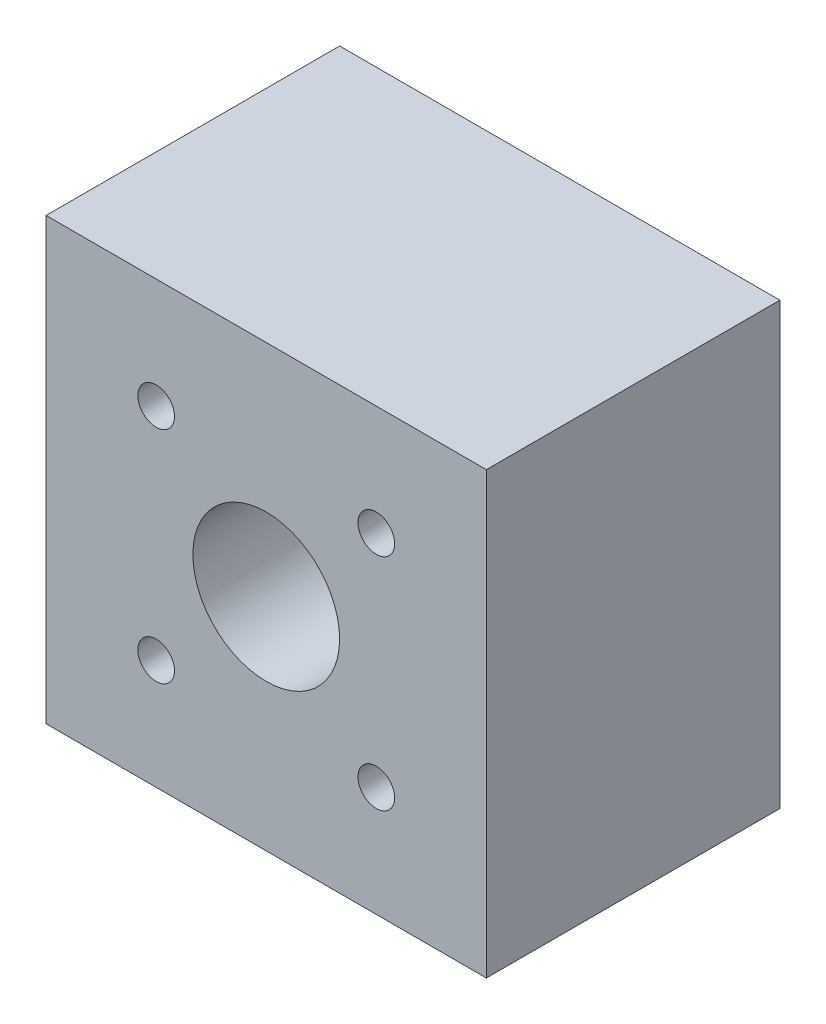
ISO-10303-21;
HEADER;
FILE_DESCRIPTION(('STEP AP214'),'2;1');
FILE_NAME('part.step','',(''),(''),'','','');
FILE_SCHEMA(('AUTOMOTIVE_DESIGN { 1 0 10303 214 1 1 1 1 }'));
ENDSEC;
DATA;
#1=APPLICATION_CONTEXT('core data for automotive mechanical design processes');
#2=APPLICATION_PROTOCOL_DEFINITION('international standard','automotive_design',2000,#1);
#3=PRODUCT_CONTEXT('',#1,'mechanical');
#4=PRODUCT('Part','Part','',(#3));
#5=PRODUCT_RELATED_PRODUCT_CATEGORY('part','',(#4));
#6=PRODUCT_DEFINITION_FORMATION('','',#4);
#7=PRODUCT_DEFINITION_CONTEXT('part definition',#1,'design');
#8=PRODUCT_DEFINITION('design','',#6,#7);
#9=PRODUCT_DEFINITION_SHAPE('','',#8);
#10=(LENGTH_UNIT() NAMED_UNIT(*) SI_UNIT(.MILLI.,.METRE.));
#11=(NAMED_UNIT(*) PLANE_ANGLE_UNIT() SI_UNIT($,.RADIAN.));
#12=(NAMED_UNIT(*) SI_UNIT($,.STERADIAN.) SOLID_ANGLE_UNIT());
#13=UNCERTAINTY_MEASURE_WITH_UNIT(LENGTH_MEASURE(1.E-05),#10,'distance_accuracy_value','');
#14=(GEOMETRIC_REPRESENTATION_CONTEXT(3) GLOBAL_UNCERTAINTY_ASSIGNED_CONTEXT((#13)) GLOBAL_UNIT_ASSIGNED_CONTEXT((#10,
#11,#12)) REPRESENTATION_CONTEXT('',''));
#15=CARTESIAN_POINT('',(0.,0.,0.));
#16=DIRECTION('',(0.,0.,1.));
#17=DIRECTION('',(1.,0.,0.));
#18=AXIS2_PLACEMENT_3D('',#15,#16,#17);
#19=CARTESIAN_POINT('',(15.,15.,0.));
#20=DIRECTION('',(0.,0.,-1.));
#21=DIRECTION('',(1.,0.,0.));
#22=AXIS2_PLACEMENT_3D('',#19,#20,#21);
#23=CYLINDRICAL_SURFACE('',#22,2.5);
#24=CARTESIAN_POINT('',(15.,15.,0.));
#25=DIRECTION('',(0.,0.,1.));
#26=DIRECTION('',(1.,0.,0.));
#27=AXIS2_PLACEMENT_3D('',#24,#25,#26);
#28=CIRCLE('',#27,2.5);
#29=CARTESIAN_POINT('',(17.5,15.,0.));
#30=VERTEX_POINT('',#29);
#31=EDGE_CURVE('E109',#30,#30,#28,.T.);
#32=ORIENTED_EDGE('',*,*,#31,.F.);
#33=DIRECTION('',(0.,0.,1.));
#34=VECTOR('',#33,1.);
#35=CARTESIAN_POINT('',(17.5,15.,0.));
#36=LINE('',#35,#34);
#37=CARTESIAN_POINT('',(17.5,15.,40.));
#38=VERTEX_POINT('',#37);
#39=EDGE_CURVE('E10',#30,#38,#36,.T.);
#40=ORIENTED_EDGE('',*,*,#39,.T.);
#41=CARTESIAN_POINT('',(15.,15.,40.));
#42=DIRECTION('',(0.,0.,-1.));
#43=DIRECTION('',(1.,0.,0.));
#44=AXIS2_PLACEMENT_3D('',#41,#42,#43);
#45=CIRCLE('',#44,2.5);
#46=EDGE_CURVE('E110',#38,#38,#45,.T.);
#47=ORIENTED_EDGE('',*,*,#46,.F.);
#48=ORIENTED_EDGE('',*,*,#39,.F.);
#49=EDGE_LOOP('',(#32,#40,#47,#48));
#50=FACE_BOUND('',#49,.T.);
#51=ADVANCED_FACE('F16',(#50),#23,.F.);
#52=CARTESIAN_POINT('',(0.,0.,0.));
#53=DIRECTION('',(0.,0.,-1.));
#54=DIRECTION('',(1.,0.,0.));
#55=AXIS2_PLACEMENT_3D('',#52,#53,#54);
#56=CYLINDRICAL_SURFACE('',#55,10.);
#57=DIRECTION('',(0.,0.,1.));
#58=VECTOR('',#57,1.);
#59=CARTESIAN_POINT('',(10.,0.,0.));
#60=LINE('',#59,#58);
#61=CARTESIAN_POINT('',(10.,0.,0.));
#62=VERTEX_POINT('',#61);
#63=CARTESIAN_POINT('',(10.,0.,40.));
#64=VERTEX_POINT('',#63);
#65=EDGE_CURVE('E25',#62,#64,#60,.T.);
#66=ORIENTED_EDGE('',*,*,#65,.F.);
#67=CARTESIAN_POINT('',(0.,0.,0.));
#68=DIRECTION('',(0.,0.,1.));
#69=DIRECTION('',(1.,0.,0.));
#70=AXIS2_PLACEMENT_3D('',#67,#68,#69);
#71=CIRCLE('',#70,10.);
#72=EDGE_CURVE('E116',#62,#62,#71,.T.);
#73=ORIENTED_EDGE('',*,*,#72,.F.);
#74=ORIENTED_EDGE('',*,*,#65,.T.);
#75=CARTESIAN_POINT('',(0.,0.,40.));
#76=DIRECTION('',(0.,0.,-1.));
#77=DIRECTION('',(1.,0.,0.));
#78=AXIS2_PLACEMENT_3D('',#75,#76,#77);
#79=CIRCLE('',#78,10.);
#80=EDGE_CURVE('E141',#64,#64,#79,.T.);
#81=ORIENTED_EDGE('',*,*,#80,.F.);
#82=EDGE_LOOP('',(#66,#73,#74,#81));
#83=FACE_BOUND('',#82,.T.);
#84=ADVANCED_FACE('F253',(#83),#56,.F.);
#85=CARTESIAN_POINT('',(-15.,15.,0.));
#86=DIRECTION('',(0.,0.,-1.));
#87=DIRECTION('',(1.,0.,0.));
#88=AXIS2_PLACEMENT_3D('',#85,#86,#87);
#89=CYLINDRICAL_SURFACE('',#88,2.5);
#90=CARTESIAN_POINT('',(-15.,15.,0.));
#91=DIRECTION('',(0.,0.,1.));
#92=DIRECTION('',(1.,0.,0.));
#93=AXIS2_PLACEMENT_3D('',#90,#91,#92);
#94=CIRCLE('',#93,2.5);
#95=CARTESIAN_POINT('',(-12.5,15.,0.));
#96=VERTEX_POINT('',#95);
#97=EDGE_CURVE('E125',#96,#96,#94,.T.);
#98=ORIENTED_EDGE('',*,*,#97,.F.);
#99=DIRECTION('',(0.,0.,1.));
#100=VECTOR('',#99,1.);
#101=CARTESIAN_POINT('',(-12.5,15.,0.));
#102=LINE('',#101,#100);
#103=CARTESIAN_POINT('',(-12.5,15.,40.));
#104=VERTEX_POINT('',#103);
#105=EDGE_CURVE('E151',#96,#104,#102,.T.);
#106=ORIENTED_EDGE('',*,*,#105,.T.);
#107=CARTESIAN_POINT('',(-15.,15.,40.));
#108=DIRECTION('',(0.,0.,-1.));
#109=DIRECTION('',(1.,0.,0.));
#110=AXIS2_PLACEMENT_3D('',#107,#108,#109);
#111=CIRCLE('',#110,2.5);
#112=EDGE_CURVE('E137',#104,#104,#111,.T.);
#113=ORIENTED_EDGE('',*,*,#112,.F.);
#114=ORIENTED_EDGE('',*,*,#105,.F.);
#115=EDGE_LOOP('',(#98,#106,#113,#114));
#116=FACE_BOUND('',#115,.T.);
#117=ADVANCED_FACE('F258',(#116),#89,.F.);
#118=CARTESIAN_POINT('',(15.,-15.,0.));
#119=DIRECTION('',(0.,0.,-1.));
#120=DIRECTION('',(1.,0.,0.));
#121=AXIS2_PLACEMENT_3D('',#118,#119,#120);
#122=CYLINDRICAL_SURFACE('',#121,2.5);
#123=CARTESIAN_POINT('',(15.,-15.,0.));
#124=DIRECTION('',(0.,0.,1.));
#125=DIRECTION('',(1.,0.,0.));
#126=AXIS2_PLACEMENT_3D('',#123,#124,#125);
#127=CIRCLE('',#126,2.5);
#128=CARTESIAN_POINT('',(17.5,-15.,0.));
#129=VERTEX_POINT('',#128);
#130=EDGE_CURVE('E164',#129,#129,#127,.T.);
#131=ORIENTED_EDGE('',*,*,#130,.F.);
#132=DIRECTION('',(0.,0.,1.));
#133=VECTOR('',#132,1.);
#134=CARTESIAN_POINT('',(17.5,-15.,0.));
#135=LINE('',#134,#133);
#136=CARTESIAN_POINT('',(17.5,-15.,40.));
#137=VERTEX_POINT('',#136);
#138=EDGE_CURVE('E149',#129,#137,#135,.T.);
#139=ORIENTED_EDGE('',*,*,#138,.T.);
#140=CARTESIAN_POINT('',(15.,-15.,40.));
#141=DIRECTION('',(0.,0.,-1.));
#142=DIRECTION('',(1.,0.,0.));
#143=AXIS2_PLACEMENT_3D('',#140,#141,#142);
#144=CIRCLE('',#143,2.5);
#145=EDGE_CURVE('E133',#137,#137,#144,.T.);
#146=ORIENTED_EDGE('',*,*,#145,.F.);
#147=ORIENTED_EDGE('',*,*,#138,.F.);
#148=EDGE_LOOP('',(#131,#139,#146,#147));
#149=FACE_BOUND('',#148,.T.);
#150=ADVANCED_FACE('F18',(#149),#122,.F.);
#151=CARTESIAN_POINT('',(-15.,-15.,0.));
#152=DIRECTION('',(0.,0.,-1.));
#153=DIRECTION('',(1.,0.,0.));
#154=AXIS2_PLACEMENT_3D('',#151,#152,#153);
#155=CYLINDRICAL_SURFACE('',#154,2.5);
#156=CARTESIAN_POINT('',(-15.,-15.,0.));
#157=DIRECTION('',(0.,0.,1.));
#158=DIRECTION('',(1.,0.,0.));
#159=AXIS2_PLACEMENT_3D('',#156,#157,#158);
#160=CIRCLE('',#159,2.5);
#161=CARTESIAN_POINT('',(-12.5,-15.,0.));
#162=VERTEX_POINT('',#161);
#163=EDGE_CURVE('E194',#162,#162,#160,.T.);
#164=ORIENTED_EDGE('',*,*,#163,.F.);
#165=DIRECTION('',(0.,0.,1.));
#166=VECTOR('',#165,1.);
#167=CARTESIAN_POINT('',(-12.5,-15.,0.));
#168=LINE('',#167,#166);
#169=CARTESIAN_POINT('',(-12.5,-15.,40.));
#170=VERTEX_POINT('',#169);
#171=EDGE_CURVE('E146',#162,#170,#168,.T.);
#172=ORIENTED_EDGE('',*,*,#171,.T.);
#173=CARTESIAN_POINT('',(-15.,-15.,40.));
#174=DIRECTION('',(0.,0.,-1.));
#175=DIRECTION('',(1.,0.,0.));
#176=AXIS2_PLACEMENT_3D('',#173,#174,#175);
#177=CIRCLE('',#176,2.5);
#178=EDGE_CURVE('E122',#170,#170,#177,.T.);
#179=ORIENTED_EDGE('',*,*,#178,.F.);
#180=ORIENTED_EDGE('',*,*,#171,.F.);
#181=EDGE_LOOP('',(#164,#172,#179,#180));
#182=FACE_BOUND('',#181,.T.);
#183=ADVANCED_FACE('F269',(#182),#155,.F.);
#184=CARTESIAN_POINT('',(30.,30.,0.));
#185=DIRECTION('',(0.,-1.,0.));
#186=DIRECTION('',(0.,0.,-1.));
#187=AXIS2_PLACEMENT_3D('',#184,#185,#186);
#188=PLANE('',#187);
#189=DIRECTION('',(-1.,0.,0.));
#190=VECTOR('',#189,1.);
#191=CARTESIAN_POINT('',(30.,30.,0.));
#192=LINE('',#191,#190);
#193=CARTESIAN_POINT('',(30.,30.,0.));
#194=VERTEX_POINT('',#193);
#195=CARTESIAN_POINT('',(-30.,30.,0.));
#196=VERTEX_POINT('',#195);
#197=EDGE_CURVE('E169',#194,#196,#192,.T.);
#198=ORIENTED_EDGE('',*,*,#197,.T.);
#199=DIRECTION('',(0.,0.,1.));
#200=VECTOR('',#199,1.);
#201=CARTESIAN_POINT('',(-30.,30.,0.));
#202=LINE('',#201,#200);
#203=CARTESIAN_POINT('',(-30.,30.,40.));
#204=VERTEX_POINT('',#203);
#205=EDGE_CURVE('E176',#196,#204,#202,.T.);
#206=ORIENTED_EDGE('',*,*,#205,.T.);
#207=DIRECTION('',(-1.,0.,0.));
#208=VECTOR('',#207,1.);
#209=CARTESIAN_POINT('',(30.,30.,40.));
#210=LINE('',#209,#208);
#211=CARTESIAN_POINT('',(30.,30.,40.));
#212=VERTEX_POINT('',#211);
#213=EDGE_CURVE('E115',#212,#204,#210,.T.);
#214=ORIENTED_EDGE('',*,*,#213,.F.);
#215=DIRECTION('',(0.,0.,1.));
#216=VECTOR('',#215,1.);
#217=CARTESIAN_POINT('',(30.,30.,0.));
#218=LINE('',#217,#216);
#219=EDGE_CURVE('E170',#194,#212,#218,.T.);
#220=ORIENTED_EDGE('',*,*,#219,.F.);
#221=EDGE_LOOP('',(#198,#206,#214,#220));
#222=FACE_BOUND('',#221,.T.);
#223=ADVANCED_FACE('F228',(#222),#188,.F.);
#224=CARTESIAN_POINT('',(0.,0.,40.));
#225=DIRECTION('',(0.,0.,1.));
#226=DIRECTION('',(1.,0.,0.));
#227=AXIS2_PLACEMENT_3D('',#224,#225,#226);
#228=PLANE('',#227);
#229=ORIENTED_EDGE('',*,*,#46,.T.);
#230=EDGE_LOOP('',(#229));
#231=FACE_BOUND('',#230,.T.);
#232=ORIENTED_EDGE('',*,*,#80,.T.);
#233=EDGE_LOOP('',(#232));
#234=FACE_BOUND('',#233,.T.);
#235=ORIENTED_EDGE('',*,*,#112,.T.);
#236=EDGE_LOOP('',(#235));
#237=FACE_BOUND('',#236,.T.);
#238=ORIENTED_EDGE('',*,*,#145,.T.);
#239=EDGE_LOOP('',(#238));
#240=FACE_BOUND('',#239,.T.);
#241=ORIENTED_EDGE('',*,*,#178,.T.);
#242=EDGE_LOOP('',(#241));
#243=FACE_BOUND('',#242,.T.);
#244=DIRECTION('',(1.,0.,0.));
#245=VECTOR('',#244,1.);
#246=CARTESIAN_POINT('',(-30.,-30.,40.));
#247=LINE('',#246,#245);
#248=CARTESIAN_POINT('',(-30.,-30.,40.));
#249=VERTEX_POINT('',#248);
#250=CARTESIAN_POINT('',(30.,-30.,40.));
#251=VERTEX_POINT('',#250);
#252=EDGE_CURVE('E199',#249,#251,#247,.T.);
#253=ORIENTED_EDGE('',*,*,#252,.T.);
#254=DIRECTION('',(0.,1.,0.));
#255=VECTOR('',#254,1.);
#256=CARTESIAN_POINT('',(30.,-30.,40.));
#257=LINE('',#256,#255);
#258=EDGE_CURVE('E165',#251,#212,#257,.T.);
#259=ORIENTED_EDGE('',*,*,#258,.T.);
#260=ORIENTED_EDGE('',*,*,#213,.T.);
#261=DIRECTION('',(0.,-1.,0.));
#262=VECTOR('',#261,1.);
#263=CARTESIAN_POINT('',(-30.,30.,40.));
#264=LINE('',#263,#262);
#265=EDGE_CURVE('E178',#204,#249,#264,.T.);
#266=ORIENTED_EDGE('',*,*,#265,.T.);
#267=EDGE_LOOP('',(#253,#259,#260,#266));
#268=FACE_BOUND('',#267,.T.);
#269=ADVANCED_FACE('F236',(#231,#234,#237,#240,#243,#268),#228,.T.);
#270=CARTESIAN_POINT('',(0.,0.,0.));
#271=DIRECTION('',(0.,0.,1.));
#272=DIRECTION('',(1.,0.,0.));
#273=AXIS2_PLACEMENT_3D('',#270,#271,#272);
#274=PLANE('',#273);
#275=ORIENTED_EDGE('',*,*,#31,.T.);
#276=EDGE_LOOP('',(#275));
#277=FACE_BOUND('',#276,.T.);
#278=ORIENTED_EDGE('',*,*,#72,.T.);
#279=EDGE_LOOP('',(#278));
#280=FACE_BOUND('',#279,.T.);
#281=ORIENTED_EDGE('',*,*,#97,.T.);
#282=EDGE_LOOP('',(#281));
#283=FACE_BOUND('',#282,.T.);
#284=ORIENTED_EDGE('',*,*,#130,.T.);
#285=EDGE_LOOP('',(#284));
#286=FACE_BOUND('',#285,.T.);
#287=ORIENTED_EDGE('',*,*,#163,.T.);
#288=EDGE_LOOP('',(#287));
#289=FACE_BOUND('',#288,.T.);
#290=DIRECTION('',(0.,-1.,0.));
#291=VECTOR('',#290,1.);
#292=CARTESIAN_POINT('',(-30.,30.,0.));
#293=LINE('',#292,#291);
#294=CARTESIAN_POINT('',(-30.,-30.,0.));
#295=VERTEX_POINT('',#294);
#296=EDGE_CURVE('E181',#196,#295,#293,.T.);
#297=ORIENTED_EDGE('',*,*,#296,.F.);
#298=ORIENTED_EDGE('',*,*,#197,.F.);
#299=DIRECTION('',(0.,1.,0.));
#300=VECTOR('',#299,1.);
#301=CARTESIAN_POINT('',(30.,-30.,0.));
#302=LINE('',#301,#300);
#303=CARTESIAN_POINT('',(30.,-30.,0.));
#304=VERTEX_POINT('',#303);
#305=EDGE_CURVE('E172',#304,#194,#302,.T.);
#306=ORIENTED_EDGE('',*,*,#305,.F.);
#307=DIRECTION('',(1.,0.,0.));
#308=VECTOR('',#307,1.);
#309=CARTESIAN_POINT('',(-30.,-30.,0.));
#310=LINE('',#309,#308);
#311=EDGE_CURVE('E216',#295,#304,#310,.T.);
#312=ORIENTED_EDGE('',*,*,#311,.F.);
#313=EDGE_LOOP('',(#297,#298,#306,#312));
#314=FACE_BOUND('',#313,.T.);
#315=ADVANCED_FACE('F112',(#277,#280,#283,#286,#289,#314),#274,.F.);
#316=CARTESIAN_POINT('',(30.,-30.,0.));
#317=DIRECTION('',(-1.,0.,0.));
#318=DIRECTION('',(0.,0.,1.));
#319=AXIS2_PLACEMENT_3D('',#316,#317,#318);
#320=PLANE('',#319);
#321=ORIENTED_EDGE('',*,*,#305,.T.);
#322=ORIENTED_EDGE('',*,*,#219,.T.);
#323=ORIENTED_EDGE('',*,*,#258,.F.);
#324=DIRECTION('',(0.,0.,1.));
#325=VECTOR('',#324,1.);
#326=CARTESIAN_POINT('',(30.,-30.,0.));
#327=LINE('',#326,#325);
#328=EDGE_CURVE('E204',#304,#251,#327,.T.);
#329=ORIENTED_EDGE('',*,*,#328,.F.);
#330=EDGE_LOOP('',(#321,#322,#323,#329));
#331=FACE_BOUND('',#330,.T.);
#332=ADVANCED_FACE('F239',(#331),#320,.F.);
#333=CARTESIAN_POINT('',(-30.,30.,0.));
#334=DIRECTION('',(1.,0.,0.));
#335=DIRECTION('',(0.,1.,0.));
#336=AXIS2_PLACEMENT_3D('',#333,#334,#335);
#337=PLANE('',#336);
#338=ORIENTED_EDGE('',*,*,#296,.T.);
#339=DIRECTION('',(0.,0.,1.));
#340=VECTOR('',#339,1.);
#341=CARTESIAN_POINT('',(-30.,-30.,0.));
#342=LINE('',#341,#340);
#343=EDGE_CURVE('E189',#295,#249,#342,.T.);
#344=ORIENTED_EDGE('',*,*,#343,.T.);
#345=ORIENTED_EDGE('',*,*,#265,.F.);
#346=ORIENTED_EDGE('',*,*,#205,.F.);
#347=EDGE_LOOP('',(#338,#344,#345,#346));
#348=FACE_BOUND('',#347,.T.);
#349=ADVANCED_FACE('F232',(#348),#337,.F.);
#350=CARTESIAN_POINT('',(-30.,-30.,0.));
#351=DIRECTION('',(0.,1.,0.));
#352=DIRECTION('',(1.,0.,0.));
#353=AXIS2_PLACEMENT_3D('',#350,#351,#352);
#354=PLANE('',#353);
#355=ORIENTED_EDGE('',*,*,#311,.T.);
#356=ORIENTED_EDGE('',*,*,#328,.T.);
#357=ORIENTED_EDGE('',*,*,#252,.F.);
#358=ORIENTED_EDGE('',*,*,#343,.F.);
#359=EDGE_LOOP('',(#355,#356,#357,#358));
#360=FACE_BOUND('',#359,.T.);
#361=ADVANCED_FACE('F243',(#360),#354,.F.);
#362=CLOSED_SHELL('',(#51,#84,#117,#150,#183,#223,#269,#315,#332,#349,#361));
#363=MANIFOLD_SOLID_BREP('B1',#362);
#364=ADVANCED_BREP_SHAPE_REPRESENTATION('',(#18,#363),#14);
#365=SHAPE_DEFINITION_REPRESENTATION(#9,#364);
ENDSEC;
END-ISO-10303-21;
